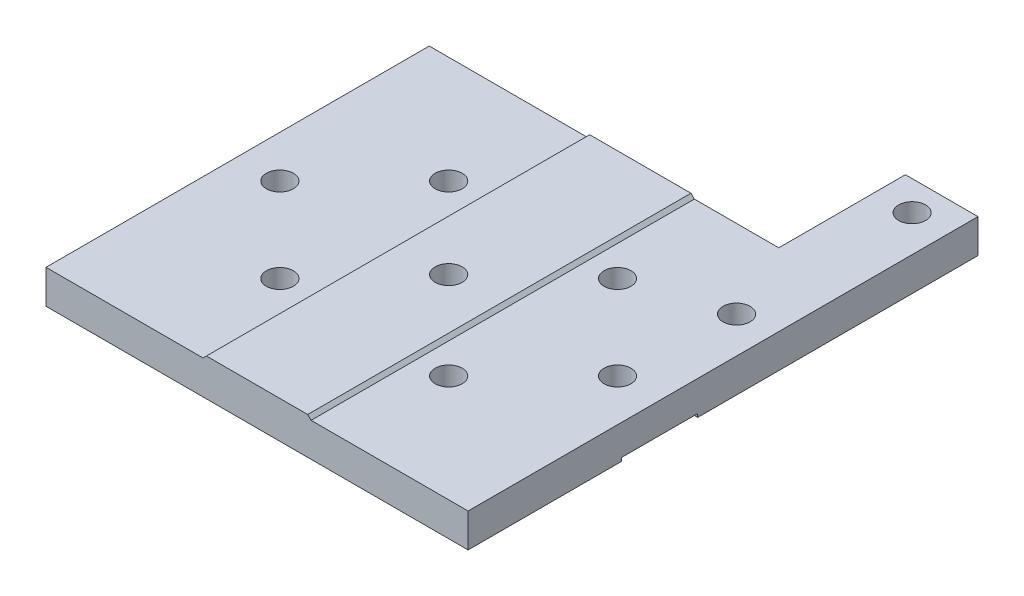
ISO-10303-21;
HEADER;
FILE_DESCRIPTION(('STEP AP214'),'2;1');
FILE_NAME('part.step','',(''),(''),'','','');
FILE_SCHEMA(('AUTOMOTIVE_DESIGN { 1 0 10303 214 1 1 1 1 }'));
ENDSEC;
DATA;
#1=APPLICATION_CONTEXT('core data for automotive mechanical design processes');
#2=APPLICATION_PROTOCOL_DEFINITION('international standard','automotive_design',2000,#1);
#3=PRODUCT_CONTEXT('',#1,'mechanical');
#4=PRODUCT('Part','Part','',(#3));
#5=PRODUCT_RELATED_PRODUCT_CATEGORY('part','',(#4));
#6=PRODUCT_DEFINITION_FORMATION('','',#4);
#7=PRODUCT_DEFINITION_CONTEXT('part definition',#1,'design');
#8=PRODUCT_DEFINITION('design','',#6,#7);
#9=PRODUCT_DEFINITION_SHAPE('','',#8);
#10=(LENGTH_UNIT() NAMED_UNIT(*) SI_UNIT(.MILLI.,.METRE.));
#11=(NAMED_UNIT(*) PLANE_ANGLE_UNIT() SI_UNIT($,.RADIAN.));
#12=(NAMED_UNIT(*) SI_UNIT($,.STERADIAN.) SOLID_ANGLE_UNIT());
#13=UNCERTAINTY_MEASURE_WITH_UNIT(LENGTH_MEASURE(1.E-05),#10,'distance_accuracy_value','');
#14=(GEOMETRIC_REPRESENTATION_CONTEXT(3) GLOBAL_UNCERTAINTY_ASSIGNED_CONTEXT((#13)) GLOBAL_UNIT_ASSIGNED_CONTEXT((#10,
#11,#12)) REPRESENTATION_CONTEXT('',''));
#15=CARTESIAN_POINT('',(0.,0.,0.));
#16=DIRECTION('',(0.,0.,1.));
#17=DIRECTION('',(1.,0.,0.));
#18=AXIS2_PLACEMENT_3D('',#15,#16,#17);
#19=CARTESIAN_POINT('',(0.,4.,-45.4));
#20=DIRECTION('',(0.,0.,1.));
#21=DIRECTION('',(1.,0.,0.));
#22=AXIS2_PLACEMENT_3D('',#19,#20,#21);
#23=PLANE('',#22);
#24=DIRECTION('',(0.,1.,0.));
#25=VECTOR('',#24,1.);
#26=CARTESIAN_POINT('',(41.4,0.,-45.4));
#27=LINE('',#26,#25);
#28=CARTESIAN_POINT('',(41.4,0.,-45.4));
#29=VERTEX_POINT('',#28);
#30=CARTESIAN_POINT('',(41.4,4.,-45.4));
#31=VERTEX_POINT('',#30);
#32=EDGE_CURVE('E53',#29,#31,#27,.T.);
#33=ORIENTED_EDGE('',*,*,#32,.F.);
#34=DIRECTION('',(-1.,0.,0.));
#35=VECTOR('',#34,1.);
#36=CARTESIAN_POINT('',(0.,0.,-45.4));
#37=LINE('',#36,#35);
#38=CARTESIAN_POINT('',(0.,0.,-45.4));
#39=VERTEX_POINT('',#38);
#40=EDGE_CURVE('E258',#29,#39,#37,.T.);
#41=ORIENTED_EDGE('',*,*,#40,.T.);
#42=DIRECTION('',(0.,-1.,0.));
#43=VECTOR('',#42,1.);
#44=CARTESIAN_POINT('',(0.,4.,-45.4));
#45=LINE('',#44,#43);
#46=CARTESIAN_POINT('',(0.,4.,-45.4));
#47=VERTEX_POINT('',#46);
#48=EDGE_CURVE('E267',#47,#39,#45,.T.);
#49=ORIENTED_EDGE('',*,*,#48,.F.);
#50=DIRECTION('',(-1.,0.,0.));
#51=VECTOR('',#50,1.);
#52=CARTESIAN_POINT('',(0.,4.,-45.4));
#53=LINE('',#52,#51);
#54=CARTESIAN_POINT('',(18.6,4.,-45.4));
#55=VERTEX_POINT('',#54);
#56=EDGE_CURVE('E264',#55,#47,#53,.T.);
#57=ORIENTED_EDGE('',*,*,#56,.F.);
#58=DIRECTION('',(0.707106781186541,0.707106781186554,0.));
#59=VECTOR('',#58,1.);
#60=CARTESIAN_POINT('',(9.30000000000017,-5.30000000000001,-45.4));
#61=LINE('',#60,#59);
#62=CARTESIAN_POINT('',(19.,4.4,-45.4));
#63=VERTEX_POINT('',#62);
#64=EDGE_CURVE('E11',#55,#63,#61,.T.);
#65=ORIENTED_EDGE('',*,*,#64,.T.);
#66=DIRECTION('',(1.,0.,0.));
#67=VECTOR('',#66,1.);
#68=CARTESIAN_POINT('',(19.,4.4,-45.4));
#69=LINE('',#68,#67);
#70=CARTESIAN_POINT('',(31.,4.4,-45.4));
#71=VERTEX_POINT('',#70);
#72=EDGE_CURVE('E219',#63,#71,#69,.T.);
#73=ORIENTED_EDGE('',*,*,#72,.T.);
#74=DIRECTION('',(0.707106781186548,-0.707106781186548,0.));
#75=VECTOR('',#74,1.);
#76=CARTESIAN_POINT('',(15.7,19.7,-45.4));
#77=LINE('',#76,#75);
#78=CARTESIAN_POINT('',(31.4,4.,-45.4));
#79=VERTEX_POINT('',#78);
#80=EDGE_CURVE('E288',#71,#79,#77,.T.);
#81=ORIENTED_EDGE('',*,*,#80,.T.);
#82=EDGE_CURVE('E265',#31,#79,#53,.T.);
#83=ORIENTED_EDGE('',*,*,#82,.F.);
#84=EDGE_LOOP('',(#33,#41,#49,#57,#65,#73,#81,#83));
#85=FACE_BOUND('',#84,.T.);
#86=ADVANCED_FACE('F37',(#85),#23,.F.);
#87=CARTESIAN_POINT('',(0.,0.,0.));
#88=DIRECTION('',(0.,-1.,0.));
#89=DIRECTION('',(0.,0.,-1.));
#90=AXIS2_PLACEMENT_3D('',#87,#88,#89);
#91=PLANE('',#90);
#92=DIRECTION('',(-1.,0.,0.));
#93=VECTOR('',#92,1.);
#94=CARTESIAN_POINT('',(0.,0.,-18.2));
#95=LINE('',#94,#93);
#96=CARTESIAN_POINT('',(50.,0.,-18.2));
#97=VERTEX_POINT('',#96);
#98=CARTESIAN_POINT('',(0.,0.,-18.2));
#99=VERTEX_POINT('',#98);
#100=EDGE_CURVE('E201',#97,#99,#95,.T.);
#101=ORIENTED_EDGE('',*,*,#100,.F.);
#102=DIRECTION('',(0.,0.,-1.));
#103=VECTOR('',#102,1.);
#104=CARTESIAN_POINT('',(50.,0.,0.));
#105=LINE('',#104,#103);
#106=CARTESIAN_POINT('',(50.,0.,0.));
#107=VERTEX_POINT('',#106);
#108=EDGE_CURVE('E151',#107,#97,#105,.T.);
#109=ORIENTED_EDGE('',*,*,#108,.F.);
#110=DIRECTION('',(1.,0.,0.));
#111=VECTOR('',#110,1.);
#112=CARTESIAN_POINT('',(0.,0.,0.));
#113=LINE('',#112,#111);
#114=CARTESIAN_POINT('',(0.,0.,0.));
#115=VERTEX_POINT('',#114);
#116=EDGE_CURVE('E152',#115,#107,#113,.T.);
#117=ORIENTED_EDGE('',*,*,#116,.F.);
#118=DIRECTION('',(0.,0.,1.));
#119=VECTOR('',#118,1.);
#120=CARTESIAN_POINT('',(0.,0.,0.));
#121=LINE('',#120,#119);
#122=EDGE_CURVE('E251',#99,#115,#121,.T.);
#123=ORIENTED_EDGE('',*,*,#122,.F.);
#124=EDGE_LOOP('',(#101,#109,#117,#123));
#125=FACE_BOUND('',#124,.T.);
#126=CARTESIAN_POINT('',(15.0000000000002,0.,-12.7));
#127=DIRECTION('',(0.,1.,0.));
#128=DIRECTION('',(0.,0.,1.));
#129=AXIS2_PLACEMENT_3D('',#126,#127,#128);
#130=CIRCLE('',#129,1.6);
#131=CARTESIAN_POINT('',(15.0000000000002,0.,-11.1));
#132=VERTEX_POINT('',#131);
#133=EDGE_CURVE('E221',#132,#132,#130,.T.);
#134=ORIENTED_EDGE('',*,*,#133,.T.);
#135=EDGE_LOOP('',(#134));
#136=FACE_BOUND('',#135,.T.);
#137=CARTESIAN_POINT('',(35.0000000000002,0.,-12.7));
#138=DIRECTION('',(0.,1.,0.));
#139=DIRECTION('',(0.,0.,1.));
#140=AXIS2_PLACEMENT_3D('',#137,#138,#139);
#141=CIRCLE('',#140,1.6);
#142=CARTESIAN_POINT('',(35.0000000000002,0.,-11.1));
#143=VERTEX_POINT('',#142);
#144=EDGE_CURVE('E233',#143,#143,#141,.T.);
#145=ORIENTED_EDGE('',*,*,#144,.T.);
#146=EDGE_LOOP('',(#145));
#147=FACE_BOUND('',#146,.T.);
#148=ADVANCED_FACE('F324',(#125,#136,#147),#91,.T.);
#149=CARTESIAN_POINT('',(0.,4.,0.));
#150=DIRECTION('',(0.,-1.,0.));
#151=DIRECTION('',(0.,0.,-1.));
#152=AXIS2_PLACEMENT_3D('',#149,#150,#151);
#153=PLANE('',#152);
#154=CARTESIAN_POINT('',(5.,4.,-22.7));
#155=DIRECTION('',(0.,-1.,0.));
#156=DIRECTION('',(0.,0.,-1.));
#157=AXIS2_PLACEMENT_3D('',#154,#155,#156);
#158=CIRCLE('',#157,1.6);
#159=CARTESIAN_POINT('',(5.,4.,-24.3));
#160=VERTEX_POINT('',#159);
#161=EDGE_CURVE('E195',#160,#160,#158,.T.);
#162=ORIENTED_EDGE('',*,*,#161,.T.);
#163=EDGE_LOOP('',(#162));
#164=FACE_BOUND('',#163,.T.);
#165=CARTESIAN_POINT('',(15.0000000000002,4.,-12.7));
#166=DIRECTION('',(0.,1.,0.));
#167=DIRECTION('',(0.,0.,1.));
#168=AXIS2_PLACEMENT_3D('',#165,#166,#167);
#169=CIRCLE('',#168,1.6);
#170=CARTESIAN_POINT('',(15.0000000000002,4.,-11.1));
#171=VERTEX_POINT('',#170);
#172=EDGE_CURVE('E230',#171,#171,#169,.T.);
#173=ORIENTED_EDGE('',*,*,#172,.F.);
#174=EDGE_LOOP('',(#173));
#175=FACE_BOUND('',#174,.T.);
#176=CARTESIAN_POINT('',(15.,4.,-32.7));
#177=DIRECTION('',(0.,1.,0.));
#178=DIRECTION('',(0.,0.,1.));
#179=AXIS2_PLACEMENT_3D('',#176,#177,#178);
#180=CIRCLE('',#179,1.6);
#181=CARTESIAN_POINT('',(15.,4.,-31.1));
#182=VERTEX_POINT('',#181);
#183=EDGE_CURVE('E248',#182,#182,#180,.T.);
#184=ORIENTED_EDGE('',*,*,#183,.F.);
#185=EDGE_LOOP('',(#184));
#186=FACE_BOUND('',#185,.T.);
#187=DIRECTION('',(1.,0.,0.));
#188=VECTOR('',#187,1.);
#189=CARTESIAN_POINT('',(0.,4.,0.));
#190=LINE('',#189,#188);
#191=CARTESIAN_POINT('',(0.,4.,0.));
#192=VERTEX_POINT('',#191);
#193=CARTESIAN_POINT('',(18.6,4.,0.));
#194=VERTEX_POINT('',#193);
#195=EDGE_CURVE('E259',#192,#194,#190,.T.);
#196=ORIENTED_EDGE('',*,*,#195,.T.);
#197=DIRECTION('',(0.,0.,-1.));
#198=VECTOR('',#197,1.);
#199=CARTESIAN_POINT('',(18.6,4.,0.));
#200=LINE('',#199,#198);
#201=EDGE_CURVE('E284',#194,#55,#200,.T.);
#202=ORIENTED_EDGE('',*,*,#201,.T.);
#203=ORIENTED_EDGE('',*,*,#56,.T.);
#204=DIRECTION('',(0.,0.,1.));
#205=VECTOR('',#204,1.);
#206=CARTESIAN_POINT('',(0.,4.,0.));
#207=LINE('',#206,#205);
#208=EDGE_CURVE('E254',#47,#192,#207,.T.);
#209=ORIENTED_EDGE('',*,*,#208,.T.);
#210=EDGE_LOOP('',(#196,#202,#203,#209));
#211=FACE_BOUND('',#210,.T.);
#212=ADVANCED_FACE('F297',(#164,#175,#186,#211),#153,.F.);
#213=CARTESIAN_POINT('',(45.7,4.,-56.9));
#214=DIRECTION('',(0.,-1.,0.));
#215=DIRECTION('',(0.,0.,-1.));
#216=AXIS2_PLACEMENT_3D('',#213,#214,#215);
#217=CIRCLE('',#216,1.6);
#218=CARTESIAN_POINT('',(45.7,4.,-58.5));
#219=VERTEX_POINT('',#218);
#220=EDGE_CURVE('E176',#219,#219,#217,.T.);
#221=ORIENTED_EDGE('',*,*,#220,.T.);
#222=EDGE_LOOP('',(#221));
#223=FACE_BOUND('',#222,.T.);
#224=CARTESIAN_POINT('',(45.7,4.,-36.1));
#225=DIRECTION('',(0.,-1.,0.));
#226=DIRECTION('',(0.,0.,-1.));
#227=AXIS2_PLACEMENT_3D('',#224,#225,#226);
#228=CIRCLE('',#227,1.6);
#229=CARTESIAN_POINT('',(45.7,4.,-37.7));
#230=VERTEX_POINT('',#229);
#231=EDGE_CURVE('E410',#230,#230,#228,.T.);
#232=ORIENTED_EDGE('',*,*,#231,.T.);
#233=EDGE_LOOP('',(#232));
#234=FACE_BOUND('',#233,.T.);
#235=CARTESIAN_POINT('',(45.,4.,-22.6999999999997));
#236=DIRECTION('',(0.,-1.,0.));
#237=DIRECTION('',(0.,0.,-1.));
#238=AXIS2_PLACEMENT_3D('',#235,#236,#237);
#239=CIRCLE('',#238,1.6);
#240=CARTESIAN_POINT('',(45.,4.,-24.2999999999997));
#241=VERTEX_POINT('',#240);
#242=EDGE_CURVE('E184',#241,#241,#239,.T.);
#243=ORIENTED_EDGE('',*,*,#242,.T.);
#244=EDGE_LOOP('',(#243));
#245=FACE_BOUND('',#244,.T.);
#246=DIRECTION('',(0.,0.,-1.));
#247=VECTOR('',#246,1.);
#248=CARTESIAN_POINT('',(50.,4.,0.));
#249=LINE('',#248,#247);
#250=CARTESIAN_POINT('',(50.,4.,0.));
#251=VERTEX_POINT('',#250);
#252=CARTESIAN_POINT('',(50.,4.,-60.4));
#253=VERTEX_POINT('',#252);
#254=EDGE_CURVE('E262',#251,#253,#249,.T.);
#255=ORIENTED_EDGE('',*,*,#254,.T.);
#256=DIRECTION('',(-1.,0.,0.));
#257=VECTOR('',#256,1.);
#258=CARTESIAN_POINT('',(50.,4.,-60.4));
#259=LINE('',#258,#257);
#260=CARTESIAN_POINT('',(41.4,4.,-60.4));
#261=VERTEX_POINT('',#260);
#262=EDGE_CURVE('E159',#253,#261,#259,.T.);
#263=ORIENTED_EDGE('',*,*,#262,.T.);
#264=DIRECTION('',(0.,0.,1.));
#265=VECTOR('',#264,1.);
#266=CARTESIAN_POINT('',(41.4,4.,-45.4));
#267=LINE('',#266,#265);
#268=EDGE_CURVE('E167',#261,#31,#267,.T.);
#269=ORIENTED_EDGE('',*,*,#268,.T.);
#270=ORIENTED_EDGE('',*,*,#82,.T.);
#271=DIRECTION('',(0.,0.,1.));
#272=VECTOR('',#271,1.);
#273=CARTESIAN_POINT('',(31.4,4.,0.));
#274=LINE('',#273,#272);
#275=CARTESIAN_POINT('',(31.4,4.,0.));
#276=VERTEX_POINT('',#275);
#277=EDGE_CURVE('E281',#79,#276,#274,.T.);
#278=ORIENTED_EDGE('',*,*,#277,.T.);
#279=EDGE_CURVE('E257',#276,#251,#190,.T.);
#280=ORIENTED_EDGE('',*,*,#279,.T.);
#281=EDGE_LOOP('',(#255,#263,#269,#270,#278,#280));
#282=FACE_BOUND('',#281,.T.);
#283=CARTESIAN_POINT('',(35.,4.,-32.7));
#284=DIRECTION('',(0.,1.,0.));
#285=DIRECTION('',(0.,0.,1.));
#286=AXIS2_PLACEMENT_3D('',#283,#284,#285);
#287=CIRCLE('',#286,1.60000000000001);
#288=CARTESIAN_POINT('',(35.,4.,-31.1));
#289=VERTEX_POINT('',#288);
#290=EDGE_CURVE('E242',#289,#289,#287,.T.);
#291=ORIENTED_EDGE('',*,*,#290,.F.);
#292=EDGE_LOOP('',(#291));
#293=FACE_BOUND('',#292,.T.);
#294=CARTESIAN_POINT('',(35.0000000000002,4.,-12.7));
#295=DIRECTION('',(0.,1.,0.));
#296=DIRECTION('',(0.,0.,1.));
#297=AXIS2_PLACEMENT_3D('',#294,#295,#296);
#298=CIRCLE('',#297,1.6);
#299=CARTESIAN_POINT('',(35.0000000000002,4.,-11.1));
#300=VERTEX_POINT('',#299);
#301=EDGE_CURVE('E236',#300,#300,#298,.T.);
#302=ORIENTED_EDGE('',*,*,#301,.F.);
#303=EDGE_LOOP('',(#302));
#304=FACE_BOUND('',#303,.T.);
#305=ADVANCED_FACE('F315',(#223,#234,#245,#282,#293,#304),#153,.F.);
#306=CARTESIAN_POINT('',(45.7,0.,-56.9));
#307=DIRECTION('',(0.,-1.,0.));
#308=DIRECTION('',(0.,0.,-1.));
#309=AXIS2_PLACEMENT_3D('',#306,#307,#308);
#310=CIRCLE('',#309,1.6);
#311=CARTESIAN_POINT('',(45.7,0.,-58.5));
#312=VERTEX_POINT('',#311);
#313=EDGE_CURVE('E414',#312,#312,#310,.T.);
#314=ORIENTED_EDGE('',*,*,#313,.F.);
#315=EDGE_LOOP('',(#314));
#316=FACE_BOUND('',#315,.T.);
#317=CARTESIAN_POINT('',(45.7,0.,-36.1));
#318=DIRECTION('',(0.,-1.,0.));
#319=DIRECTION('',(0.,0.,-1.));
#320=AXIS2_PLACEMENT_3D('',#317,#318,#319);
#321=CIRCLE('',#320,1.6);
#322=CARTESIAN_POINT('',(45.7,0.,-37.7));
#323=VERTEX_POINT('',#322);
#324=EDGE_CURVE('E173',#323,#323,#321,.T.);
#325=ORIENTED_EDGE('',*,*,#324,.F.);
#326=EDGE_LOOP('',(#325));
#327=FACE_BOUND('',#326,.T.);
#328=DIRECTION('',(1.,0.,0.));
#329=VECTOR('',#328,1.);
#330=CARTESIAN_POINT('',(0.,0.,-27.2));
#331=LINE('',#330,#329);
#332=CARTESIAN_POINT('',(0.,0.,-27.2));
#333=VERTEX_POINT('',#332);
#334=CARTESIAN_POINT('',(50.,0.,-27.2));
#335=VERTEX_POINT('',#334);
#336=EDGE_CURVE('E198',#333,#335,#331,.T.);
#337=ORIENTED_EDGE('',*,*,#336,.F.);
#338=EDGE_CURVE('E268',#39,#333,#121,.T.);
#339=ORIENTED_EDGE('',*,*,#338,.F.);
#340=ORIENTED_EDGE('',*,*,#40,.F.);
#341=DIRECTION('',(0.,0.,1.));
#342=VECTOR('',#341,1.);
#343=CARTESIAN_POINT('',(41.4,0.,-45.4));
#344=LINE('',#343,#342);
#345=CARTESIAN_POINT('',(41.4,0.,-60.4));
#346=VERTEX_POINT('',#345);
#347=EDGE_CURVE('E161',#346,#29,#344,.T.);
#348=ORIENTED_EDGE('',*,*,#347,.F.);
#349=DIRECTION('',(-1.,0.,0.));
#350=VECTOR('',#349,1.);
#351=CARTESIAN_POINT('',(50.,0.,-60.4));
#352=LINE('',#351,#350);
#353=CARTESIAN_POINT('',(50.,0.,-60.4));
#354=VERTEX_POINT('',#353);
#355=EDGE_CURVE('E157',#354,#346,#352,.T.);
#356=ORIENTED_EDGE('',*,*,#355,.F.);
#357=EDGE_CURVE('E139',#335,#354,#105,.T.);
#358=ORIENTED_EDGE('',*,*,#357,.F.);
#359=EDGE_LOOP('',(#337,#339,#340,#348,#356,#358));
#360=FACE_BOUND('',#359,.T.);
#361=CARTESIAN_POINT('',(15.,0.,-32.7));
#362=DIRECTION('',(0.,1.,0.));
#363=DIRECTION('',(0.,0.,1.));
#364=AXIS2_PLACEMENT_3D('',#361,#362,#363);
#365=CIRCLE('',#364,1.6);
#366=CARTESIAN_POINT('',(15.,0.,-31.1));
#367=VERTEX_POINT('',#366);
#368=EDGE_CURVE('E245',#367,#367,#365,.T.);
#369=ORIENTED_EDGE('',*,*,#368,.T.);
#370=EDGE_LOOP('',(#369));
#371=FACE_BOUND('',#370,.T.);
#372=CARTESIAN_POINT('',(35.,0.,-32.7));
#373=DIRECTION('',(0.,1.,0.));
#374=DIRECTION('',(0.,0.,1.));
#375=AXIS2_PLACEMENT_3D('',#372,#373,#374);
#376=CIRCLE('',#375,1.60000000000001);
#377=CARTESIAN_POINT('',(35.,0.,-31.1));
#378=VERTEX_POINT('',#377);
#379=EDGE_CURVE('E239',#378,#378,#376,.T.);
#380=ORIENTED_EDGE('',*,*,#379,.T.);
#381=EDGE_LOOP('',(#380));
#382=FACE_BOUND('',#381,.T.);
#383=ADVANCED_FACE('F164',(#316,#327,#360,#371,#382),#91,.T.);
#384=CARTESIAN_POINT('',(0.,4.,0.));
#385=DIRECTION('',(1.,0.,0.));
#386=DIRECTION('',(0.,0.,-1.));
#387=AXIS2_PLACEMENT_3D('',#384,#385,#386);
#388=PLANE('',#387);
#389=DIRECTION('',(0.,0.,-1.));
#390=VECTOR('',#389,1.);
#391=CARTESIAN_POINT('',(0.,0.4,-18.2));
#392=LINE('',#391,#390);
#393=CARTESIAN_POINT('',(0.,0.4,-18.2));
#394=VERTEX_POINT('',#393);
#395=CARTESIAN_POINT('',(0.,0.4,-27.2));
#396=VERTEX_POINT('',#395);
#397=EDGE_CURVE('E199',#394,#396,#392,.T.);
#398=ORIENTED_EDGE('',*,*,#397,.F.);
#399=DIRECTION('',(0.,-1.,0.));
#400=VECTOR('',#399,1.);
#401=CARTESIAN_POINT('',(0.,0.4,-18.2));
#402=LINE('',#401,#400);
#403=EDGE_CURVE('E211',#394,#99,#402,.T.);
#404=ORIENTED_EDGE('',*,*,#403,.T.);
#405=ORIENTED_EDGE('',*,*,#122,.T.);
#406=DIRECTION('',(0.,-1.,0.));
#407=VECTOR('',#406,1.);
#408=CARTESIAN_POINT('',(0.,4.,0.));
#409=LINE('',#408,#407);
#410=EDGE_CURVE('E278',#192,#115,#409,.T.);
#411=ORIENTED_EDGE('',*,*,#410,.F.);
#412=ORIENTED_EDGE('',*,*,#208,.F.);
#413=ORIENTED_EDGE('',*,*,#48,.T.);
#414=ORIENTED_EDGE('',*,*,#338,.T.);
#415=DIRECTION('',(0.,-1.,0.));
#416=VECTOR('',#415,1.);
#417=CARTESIAN_POINT('',(0.,0.4,-27.2));
#418=LINE('',#417,#416);
#419=EDGE_CURVE('E208',#396,#333,#418,.T.);
#420=ORIENTED_EDGE('',*,*,#419,.F.);
#421=EDGE_LOOP('',(#398,#404,#405,#411,#412,#413,#414,#420));
#422=FACE_BOUND('',#421,.T.);
#423=ADVANCED_FACE('F332',(#422),#388,.F.);
#424=CARTESIAN_POINT('',(0.,4.,0.));
#425=DIRECTION('',(0.,0.,-1.));
#426=DIRECTION('',(-1.,0.,0.));
#427=AXIS2_PLACEMENT_3D('',#424,#425,#426);
#428=PLANE('',#427);
#429=ORIENTED_EDGE('',*,*,#116,.T.);
#430=DIRECTION('',(0.,-1.,0.));
#431=VECTOR('',#430,1.);
#432=CARTESIAN_POINT('',(50.,4.,0.));
#433=LINE('',#432,#431);
#434=EDGE_CURVE('E275',#251,#107,#433,.T.);
#435=ORIENTED_EDGE('',*,*,#434,.F.);
#436=ORIENTED_EDGE('',*,*,#279,.F.);
#437=DIRECTION('',(-0.707106781186548,0.707106781186548,0.));
#438=VECTOR('',#437,1.);
#439=CARTESIAN_POINT('',(15.7,19.7,0.));
#440=LINE('',#439,#438);
#441=CARTESIAN_POINT('',(31.,4.4,0.));
#442=VERTEX_POINT('',#441);
#443=EDGE_CURVE('E286',#276,#442,#440,.T.);
#444=ORIENTED_EDGE('',*,*,#443,.T.);
#445=DIRECTION('',(-1.,0.,0.));
#446=VECTOR('',#445,1.);
#447=CARTESIAN_POINT('',(19.,4.4,0.));
#448=LINE('',#447,#446);
#449=CARTESIAN_POINT('',(19.,4.4,0.));
#450=VERTEX_POINT('',#449);
#451=EDGE_CURVE('E214',#442,#450,#448,.T.);
#452=ORIENTED_EDGE('',*,*,#451,.T.);
#453=DIRECTION('',(-0.707106781186541,-0.707106781186554,0.));
#454=VECTOR('',#453,1.);
#455=CARTESIAN_POINT('',(9.30000000000017,-5.30000000000001,0.));
#456=LINE('',#455,#454);
#457=EDGE_CURVE('E46',#450,#194,#456,.T.);
#458=ORIENTED_EDGE('',*,*,#457,.T.);
#459=ORIENTED_EDGE('',*,*,#195,.F.);
#460=ORIENTED_EDGE('',*,*,#410,.T.);
#461=EDGE_LOOP('',(#429,#435,#436,#444,#452,#458,#459,#460));
#462=FACE_BOUND('',#461,.T.);
#463=ADVANCED_FACE('F291',(#462),#428,.F.);
#464=CARTESIAN_POINT('',(50.,4.,0.));
#465=DIRECTION('',(-1.,0.,0.));
#466=DIRECTION('',(0.,0.,1.));
#467=AXIS2_PLACEMENT_3D('',#464,#465,#466);
#468=PLANE('',#467);
#469=ORIENTED_EDGE('',*,*,#108,.T.);
#470=DIRECTION('',(0.,-1.,0.));
#471=VECTOR('',#470,1.);
#472=CARTESIAN_POINT('',(50.,0.4,-18.2));
#473=LINE('',#472,#471);
#474=CARTESIAN_POINT('',(50.,0.4,-18.2));
#475=VERTEX_POINT('',#474);
#476=EDGE_CURVE('E215',#475,#97,#473,.T.);
#477=ORIENTED_EDGE('',*,*,#476,.F.);
#478=DIRECTION('',(0.,0.,1.));
#479=VECTOR('',#478,1.);
#480=CARTESIAN_POINT('',(50.,0.4,-18.2));
#481=LINE('',#480,#479);
#482=CARTESIAN_POINT('',(50.,0.4,-27.2));
#483=VERTEX_POINT('',#482);
#484=EDGE_CURVE('E203',#483,#475,#481,.T.);
#485=ORIENTED_EDGE('',*,*,#484,.F.);
#486=DIRECTION('',(0.,-1.,0.));
#487=VECTOR('',#486,1.);
#488=CARTESIAN_POINT('',(50.,0.4,-27.2));
#489=LINE('',#488,#487);
#490=EDGE_CURVE('E147',#483,#335,#489,.T.);
#491=ORIENTED_EDGE('',*,*,#490,.T.);
#492=ORIENTED_EDGE('',*,*,#357,.T.);
#493=DIRECTION('',(0.,1.,0.));
#494=VECTOR('',#493,1.);
#495=CARTESIAN_POINT('',(50.,0.,-60.4));
#496=LINE('',#495,#494);
#497=EDGE_CURVE('E144',#354,#253,#496,.T.);
#498=ORIENTED_EDGE('',*,*,#497,.T.);
#499=ORIENTED_EDGE('',*,*,#254,.F.);
#500=ORIENTED_EDGE('',*,*,#434,.T.);
#501=EDGE_LOOP('',(#469,#477,#485,#491,#492,#498,#499,#500));
#502=FACE_BOUND('',#501,.T.);
#503=ADVANCED_FACE('F142',(#502),#468,.F.);
#504=CARTESIAN_POINT('',(15.,4.,-32.7));
#505=DIRECTION('',(0.,-1.,0.));
#506=DIRECTION('',(0.,0.,-1.));
#507=AXIS2_PLACEMENT_3D('',#504,#505,#506);
#508=CYLINDRICAL_SURFACE('',#507,1.6);
#509=ORIENTED_EDGE('',*,*,#183,.T.);
#510=EDGE_LOOP('',(#509));
#511=FACE_BOUND('',#510,.T.);
#512=ORIENTED_EDGE('',*,*,#368,.F.);
#513=EDGE_LOOP('',(#512));
#514=FACE_BOUND('',#513,.T.);
#515=ADVANCED_FACE('F364',(#511,#514),#508,.F.);
#516=CARTESIAN_POINT('',(35.,4.,-32.7));
#517=DIRECTION('',(0.,-1.,0.));
#518=DIRECTION('',(0.,0.,-1.));
#519=AXIS2_PLACEMENT_3D('',#516,#517,#518);
#520=CYLINDRICAL_SURFACE('',#519,1.60000000000001);
#521=ORIENTED_EDGE('',*,*,#290,.T.);
#522=EDGE_LOOP('',(#521));
#523=FACE_BOUND('',#522,.T.);
#524=ORIENTED_EDGE('',*,*,#379,.F.);
#525=EDGE_LOOP('',(#524));
#526=FACE_BOUND('',#525,.T.);
#527=ADVANCED_FACE('F388',(#523,#526),#520,.F.);
#528=CARTESIAN_POINT('',(35.0000000000002,4.,-12.7));
#529=DIRECTION('',(0.,-1.,0.));
#530=DIRECTION('',(0.,0.,-1.));
#531=AXIS2_PLACEMENT_3D('',#528,#529,#530);
#532=CYLINDRICAL_SURFACE('',#531,1.6);
#533=ORIENTED_EDGE('',*,*,#301,.T.);
#534=EDGE_LOOP('',(#533));
#535=FACE_BOUND('',#534,.T.);
#536=ORIENTED_EDGE('',*,*,#144,.F.);
#537=EDGE_LOOP('',(#536));
#538=FACE_BOUND('',#537,.T.);
#539=ADVANCED_FACE('F382',(#535,#538),#532,.F.);
#540=CARTESIAN_POINT('',(15.0000000000002,4.,-12.7));
#541=DIRECTION('',(0.,-1.,0.));
#542=DIRECTION('',(0.,0.,-1.));
#543=AXIS2_PLACEMENT_3D('',#540,#541,#542);
#544=CYLINDRICAL_SURFACE('',#543,1.6);
#545=ORIENTED_EDGE('',*,*,#172,.T.);
#546=EDGE_LOOP('',(#545));
#547=FACE_BOUND('',#546,.T.);
#548=ORIENTED_EDGE('',*,*,#133,.F.);
#549=EDGE_LOOP('',(#548));
#550=FACE_BOUND('',#549,.T.);
#551=ADVANCED_FACE('F376',(#547,#550),#544,.F.);
#552=CARTESIAN_POINT('',(19.,4.4,-57.4066648158429));
#553=DIRECTION('',(0.,1.,0.));
#554=DIRECTION('',(-1.,0.,0.));
#555=AXIS2_PLACEMENT_3D('',#552,#553,#554);
#556=PLANE('',#555);
#557=CARTESIAN_POINT('',(25.,4.4,-22.6999999999998));
#558=DIRECTION('',(0.,-1.,0.));
#559=DIRECTION('',(0.,0.,-1.));
#560=AXIS2_PLACEMENT_3D('',#557,#558,#559);
#561=CIRCLE('',#560,1.6);
#562=CARTESIAN_POINT('',(25.,4.4,-24.2999999999998));
#563=VERTEX_POINT('',#562);
#564=EDGE_CURVE('E185',#563,#563,#561,.T.);
#565=ORIENTED_EDGE('',*,*,#564,.T.);
#566=EDGE_LOOP('',(#565));
#567=FACE_BOUND('',#566,.T.);
#568=ORIENTED_EDGE('',*,*,#72,.F.);
#569=DIRECTION('',(0.,0.,1.));
#570=VECTOR('',#569,1.);
#571=CARTESIAN_POINT('',(19.,4.4,-57.4066648158429));
#572=LINE('',#571,#570);
#573=EDGE_CURVE('E222',#63,#450,#572,.T.);
#574=ORIENTED_EDGE('',*,*,#573,.T.);
#575=ORIENTED_EDGE('',*,*,#451,.F.);
#576=DIRECTION('',(0.,0.,1.));
#577=VECTOR('',#576,1.);
#578=CARTESIAN_POINT('',(31.,4.4,-57.4066648158429));
#579=LINE('',#578,#577);
#580=EDGE_CURVE('E225',#71,#442,#579,.T.);
#581=ORIENTED_EDGE('',*,*,#580,.F.);
#582=EDGE_LOOP('',(#568,#574,#575,#581));
#583=FACE_BOUND('',#582,.T.);
#584=ADVANCED_FACE('F306',(#567,#583),#556,.T.);
#585=CARTESIAN_POINT('',(31.4,4.,0.));
#586=DIRECTION('',(-0.707106781186547,-0.707106781186547,0.));
#587=DIRECTION('',(0.,0.,1.));
#588=AXIS2_PLACEMENT_3D('',#585,#586,#587);
#589=PLANE('',#588);
#590=ORIENTED_EDGE('',*,*,#80,.F.);
#591=ORIENTED_EDGE('',*,*,#580,.T.);
#592=ORIENTED_EDGE('',*,*,#443,.F.);
#593=ORIENTED_EDGE('',*,*,#277,.F.);
#594=EDGE_LOOP('',(#590,#591,#592,#593));
#595=FACE_BOUND('',#594,.T.);
#596=ADVANCED_FACE('F310',(#595),#589,.F.);
#597=CARTESIAN_POINT('',(19.,4.39999999999999,-57.4066648158429));
#598=DIRECTION('',(0.707106781186554,-0.707106781186541,0.));
#599=DIRECTION('',(0.,0.,1.));
#600=AXIS2_PLACEMENT_3D('',#597,#598,#599);
#601=PLANE('',#600);
#602=ORIENTED_EDGE('',*,*,#64,.F.);
#603=ORIENTED_EDGE('',*,*,#201,.F.);
#604=ORIENTED_EDGE('',*,*,#457,.F.);
#605=ORIENTED_EDGE('',*,*,#573,.F.);
#606=EDGE_LOOP('',(#602,#603,#604,#605));
#607=FACE_BOUND('',#606,.T.);
#608=ADVANCED_FACE('F40',(#607),#601,.F.);
#609=CARTESIAN_POINT('',(0.,0.4,-18.2));
#610=DIRECTION('',(0.,0.,1.));
#611=DIRECTION('',(1.,0.,0.));
#612=AXIS2_PLACEMENT_3D('',#609,#610,#611);
#613=PLANE('',#612);
#614=ORIENTED_EDGE('',*,*,#100,.T.);
#615=ORIENTED_EDGE('',*,*,#403,.F.);
#616=DIRECTION('',(-1.,0.,0.));
#617=VECTOR('',#616,1.);
#618=CARTESIAN_POINT('',(0.,0.4,-18.2));
#619=LINE('',#618,#617);
#620=EDGE_CURVE('E205',#475,#394,#619,.T.);
#621=ORIENTED_EDGE('',*,*,#620,.F.);
#622=ORIENTED_EDGE('',*,*,#476,.T.);
#623=EDGE_LOOP('',(#614,#615,#621,#622));
#624=FACE_BOUND('',#623,.T.);
#625=ADVANCED_FACE('F328',(#624),#613,.F.);
#626=CARTESIAN_POINT('',(0.,0.4,-27.2));
#627=DIRECTION('',(0.,0.,-1.));
#628=DIRECTION('',(-1.,0.,0.));
#629=AXIS2_PLACEMENT_3D('',#626,#627,#628);
#630=PLANE('',#629);
#631=ORIENTED_EDGE('',*,*,#336,.T.);
#632=ORIENTED_EDGE('',*,*,#490,.F.);
#633=DIRECTION('',(1.,0.,0.));
#634=VECTOR('',#633,1.);
#635=CARTESIAN_POINT('',(0.,0.4,-27.2));
#636=LINE('',#635,#634);
#637=EDGE_CURVE('E61',#396,#483,#636,.T.);
#638=ORIENTED_EDGE('',*,*,#637,.F.);
#639=ORIENTED_EDGE('',*,*,#419,.T.);
#640=EDGE_LOOP('',(#631,#632,#638,#639));
#641=FACE_BOUND('',#640,.T.);
#642=ADVANCED_FACE('F337',(#641),#630,.F.);
#643=CARTESIAN_POINT('',(0.,0.4,0.));
#644=DIRECTION('',(0.,-1.,0.));
#645=DIRECTION('',(0.,0.,-1.));
#646=AXIS2_PLACEMENT_3D('',#643,#644,#645);
#647=PLANE('',#646);
#648=CARTESIAN_POINT('',(5.,0.4,-22.7));
#649=DIRECTION('',(0.,-1.,0.));
#650=DIRECTION('',(0.,0.,-1.));
#651=AXIS2_PLACEMENT_3D('',#648,#649,#650);
#652=CIRCLE('',#651,1.6);
#653=CARTESIAN_POINT('',(5.,0.4,-24.3));
#654=VERTEX_POINT('',#653);
#655=EDGE_CURVE('E181',#654,#654,#652,.T.);
#656=ORIENTED_EDGE('',*,*,#655,.F.);
#657=EDGE_LOOP('',(#656));
#658=FACE_BOUND('',#657,.T.);
#659=CARTESIAN_POINT('',(25.,0.4,-22.6999999999998));
#660=DIRECTION('',(0.,-1.,0.));
#661=DIRECTION('',(0.,0.,-1.));
#662=AXIS2_PLACEMENT_3D('',#659,#660,#661);
#663=CIRCLE('',#662,1.6);
#664=CARTESIAN_POINT('',(25.,0.4,-24.2999999999998));
#665=VERTEX_POINT('',#664);
#666=EDGE_CURVE('E188',#665,#665,#663,.T.);
#667=ORIENTED_EDGE('',*,*,#666,.F.);
#668=EDGE_LOOP('',(#667));
#669=FACE_BOUND('',#668,.T.);
#670=CARTESIAN_POINT('',(45.,0.4,-22.6999999999997));
#671=DIRECTION('',(0.,-1.,0.));
#672=DIRECTION('',(0.,0.,-1.));
#673=AXIS2_PLACEMENT_3D('',#670,#671,#672);
#674=CIRCLE('',#673,1.6);
#675=CARTESIAN_POINT('',(45.,0.4,-24.2999999999997));
#676=VERTEX_POINT('',#675);
#677=EDGE_CURVE('E179',#676,#676,#674,.T.);
#678=ORIENTED_EDGE('',*,*,#677,.F.);
#679=EDGE_LOOP('',(#678));
#680=FACE_BOUND('',#679,.T.);
#681=ORIENTED_EDGE('',*,*,#397,.T.);
#682=ORIENTED_EDGE('',*,*,#637,.T.);
#683=ORIENTED_EDGE('',*,*,#484,.T.);
#684=ORIENTED_EDGE('',*,*,#620,.T.);
#685=EDGE_LOOP('',(#681,#682,#683,#684));
#686=FACE_BOUND('',#685,.T.);
#687=ADVANCED_FACE('F334',(#658,#669,#680,#686),#647,.T.);
#688=CARTESIAN_POINT('',(45.,4.4,-22.6999999999997));
#689=DIRECTION('',(0.,-1.,0.));
#690=DIRECTION('',(0.,0.,-1.));
#691=AXIS2_PLACEMENT_3D('',#688,#689,#690);
#692=CYLINDRICAL_SURFACE('',#691,1.6);
#693=ORIENTED_EDGE('',*,*,#677,.T.);
#694=EDGE_LOOP('',(#693));
#695=FACE_BOUND('',#694,.T.);
#696=ORIENTED_EDGE('',*,*,#242,.F.);
#697=EDGE_LOOP('',(#696));
#698=FACE_BOUND('',#697,.T.);
#699=ADVANCED_FACE('F336',(#695,#698),#692,.F.);
#700=CARTESIAN_POINT('',(25.,4.4,-22.6999999999998));
#701=DIRECTION('',(0.,-1.,0.));
#702=DIRECTION('',(0.,0.,-1.));
#703=AXIS2_PLACEMENT_3D('',#700,#701,#702);
#704=CYLINDRICAL_SURFACE('',#703,1.6);
#705=ORIENTED_EDGE('',*,*,#564,.F.);
#706=EDGE_LOOP('',(#705));
#707=FACE_BOUND('',#706,.T.);
#708=ORIENTED_EDGE('',*,*,#666,.T.);
#709=EDGE_LOOP('',(#708));
#710=FACE_BOUND('',#709,.T.);
#711=ADVANCED_FACE('F344',(#707,#710),#704,.F.);
#712=CARTESIAN_POINT('',(5.,4.4,-22.7));
#713=DIRECTION('',(0.,-1.,0.));
#714=DIRECTION('',(0.,0.,-1.));
#715=AXIS2_PLACEMENT_3D('',#712,#713,#714);
#716=CYLINDRICAL_SURFACE('',#715,1.6);
#717=ORIENTED_EDGE('',*,*,#655,.T.);
#718=EDGE_LOOP('',(#717));
#719=FACE_BOUND('',#718,.T.);
#720=ORIENTED_EDGE('',*,*,#161,.F.);
#721=EDGE_LOOP('',(#720));
#722=FACE_BOUND('',#721,.T.);
#723=ADVANCED_FACE('F435',(#719,#722),#716,.F.);
#724=CARTESIAN_POINT('',(41.4,0.,-45.4));
#725=DIRECTION('',(-1.,0.,0.));
#726=DIRECTION('',(0.,0.,1.));
#727=AXIS2_PLACEMENT_3D('',#724,#725,#726);
#728=PLANE('',#727);
#729=ORIENTED_EDGE('',*,*,#268,.F.);
#730=DIRECTION('',(0.,1.,0.));
#731=VECTOR('',#730,1.);
#732=CARTESIAN_POINT('',(41.4,0.,-60.4));
#733=LINE('',#732,#731);
#734=EDGE_CURVE('E160',#346,#261,#733,.T.);
#735=ORIENTED_EDGE('',*,*,#734,.F.);
#736=ORIENTED_EDGE('',*,*,#347,.T.);
#737=ORIENTED_EDGE('',*,*,#32,.T.);
#738=EDGE_LOOP('',(#729,#735,#736,#737));
#739=FACE_BOUND('',#738,.T.);
#740=ADVANCED_FACE('F314',(#739),#728,.T.);
#741=CARTESIAN_POINT('',(50.,0.,-60.4));
#742=DIRECTION('',(0.,0.,-1.));
#743=DIRECTION('',(-1.,0.,0.));
#744=AXIS2_PLACEMENT_3D('',#741,#742,#743);
#745=PLANE('',#744);
#746=ORIENTED_EDGE('',*,*,#262,.F.);
#747=ORIENTED_EDGE('',*,*,#497,.F.);
#748=ORIENTED_EDGE('',*,*,#355,.T.);
#749=ORIENTED_EDGE('',*,*,#734,.T.);
#750=EDGE_LOOP('',(#746,#747,#748,#749));
#751=FACE_BOUND('',#750,.T.);
#752=ADVANCED_FACE('F156',(#751),#745,.T.);
#753=CARTESIAN_POINT('',(45.7,4.,-36.1));
#754=DIRECTION('',(0.,-1.,0.));
#755=DIRECTION('',(0.,0.,-1.));
#756=AXIS2_PLACEMENT_3D('',#753,#754,#755);
#757=CYLINDRICAL_SURFACE('',#756,1.6);
#758=ORIENTED_EDGE('',*,*,#231,.F.);
#759=EDGE_LOOP('',(#758));
#760=FACE_BOUND('',#759,.T.);
#761=ORIENTED_EDGE('',*,*,#324,.T.);
#762=EDGE_LOOP('',(#761));
#763=FACE_BOUND('',#762,.T.);
#764=ADVANCED_FACE('F421',(#760,#763),#757,.F.);
#765=CARTESIAN_POINT('',(45.7,4.,-56.9));
#766=DIRECTION('',(0.,-1.,0.));
#767=DIRECTION('',(0.,0.,-1.));
#768=AXIS2_PLACEMENT_3D('',#765,#766,#767);
#769=CYLINDRICAL_SURFACE('',#768,1.6);
#770=ORIENTED_EDGE('',*,*,#220,.F.);
#771=EDGE_LOOP('',(#770));
#772=FACE_BOUND('',#771,.T.);
#773=ORIENTED_EDGE('',*,*,#313,.T.);
#774=EDGE_LOOP('',(#773));
#775=FACE_BOUND('',#774,.T.);
#776=ADVANCED_FACE('F424',(#772,#775),#769,.F.);
#777=CLOSED_SHELL('',(#86,#148,#212,#305,#383,#423,#463,#503,#515,#527,#539,#551,#584,#596,#608,
#625,#642,#687,#699,#711,#723,#740,#752,#764,#776));
#778=MANIFOLD_SOLID_BREP('B2',#777);
#779=ADVANCED_BREP_SHAPE_REPRESENTATION('',(#18,#778),#14);
#780=SHAPE_DEFINITION_REPRESENTATION(#9,#779);
ENDSEC;
END-ISO-10303-21;
